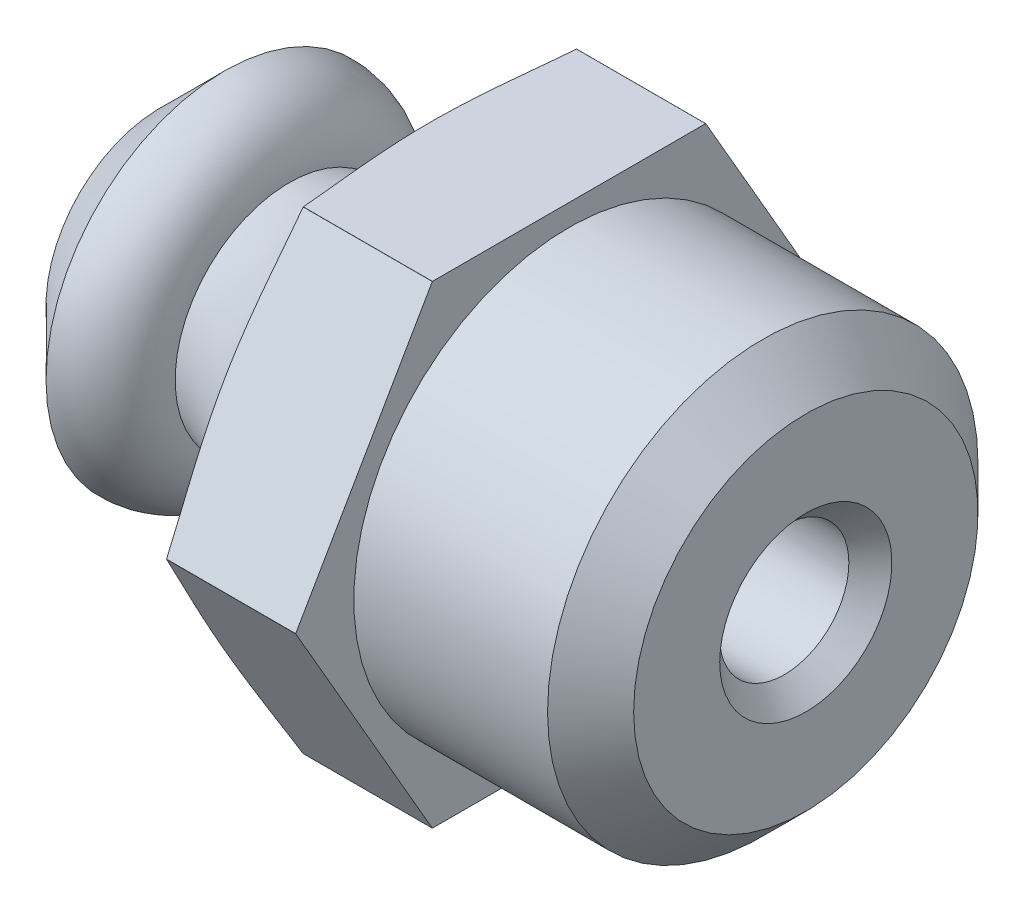
ISO-10303-21;
HEADER;
FILE_DESCRIPTION(('STEP AP214'),'2;1');
FILE_NAME('part.step','',(''),(''),'','','');
FILE_SCHEMA(('AUTOMOTIVE_DESIGN { 1 0 10303 214 1 1 1 1 }'));
ENDSEC;
DATA;
#1=APPLICATION_CONTEXT('core data for automotive mechanical design processes');
#2=APPLICATION_PROTOCOL_DEFINITION('international standard','automotive_design',2000,#1);
#3=PRODUCT_CONTEXT('',#1,'mechanical');
#4=PRODUCT('Part','Part','',(#3));
#5=PRODUCT_RELATED_PRODUCT_CATEGORY('part','',(#4));
#6=PRODUCT_DEFINITION_FORMATION('','',#4);
#7=PRODUCT_DEFINITION_CONTEXT('part definition',#1,'design');
#8=PRODUCT_DEFINITION('design','',#6,#7);
#9=PRODUCT_DEFINITION_SHAPE('','',#8);
#10=(LENGTH_UNIT() NAMED_UNIT(*) SI_UNIT(.MILLI.,.METRE.));
#11=(NAMED_UNIT(*) PLANE_ANGLE_UNIT() SI_UNIT($,.RADIAN.));
#12=(NAMED_UNIT(*) SI_UNIT($,.STERADIAN.) SOLID_ANGLE_UNIT());
#13=UNCERTAINTY_MEASURE_WITH_UNIT(LENGTH_MEASURE(1.E-05),#10,'distance_accuracy_value','');
#14=(GEOMETRIC_REPRESENTATION_CONTEXT(3) GLOBAL_UNCERTAINTY_ASSIGNED_CONTEXT((#13)) GLOBAL_UNIT_ASSIGNED_CONTEXT((#10,
#11,#12)) REPRESENTATION_CONTEXT('',''));
#15=CARTESIAN_POINT('',(0.,0.,0.));
#16=DIRECTION('',(0.,0.,1.));
#17=DIRECTION('',(1.,0.,0.));
#18=AXIS2_PLACEMENT_3D('',#15,#16,#17);
#19=CARTESIAN_POINT('',(-212.5,-8.37746538806502E-13,-3.1858908398092E-12));
#20=DIRECTION('',(-1.,0.,0.));
#21=DIRECTION('',(0.,0.,1.));
#22=AXIS2_PLACEMENT_3D('',#19,#20,#21);
#23=CONICAL_SURFACE('',#22,4.,0.785398163397446);
#24=CARTESIAN_POINT('',(-212.5,-8.37746538806502E-13,-3.1858908398092E-12));
#25=DIRECTION('',(1.,0.,0.));
#26=DIRECTION('',(0.,0.,1.));
#27=AXIS2_PLACEMENT_3D('',#24,#25,#26);
#28=CIRCLE('',#27,4.);
#29=CARTESIAN_POINT('',(-212.5,-8.37746538806502E-13,3.99999999999681));
#30=VERTEX_POINT('',#29);
#31=EDGE_CURVE('E595',#30,#30,#28,.T.);
#32=ORIENTED_EDGE('',*,*,#31,.F.);
#33=EDGE_LOOP('',(#32));
#34=FACE_BOUND('',#33,.T.);
#35=CARTESIAN_POINT('',(-213.5,-8.37746538806502E-13,-3.1858908398092E-12));
#36=DIRECTION('',(-1.,0.,0.));
#37=DIRECTION('',(0.,0.,1.));
#38=AXIS2_PLACEMENT_3D('',#35,#36,#37);
#39=CIRCLE('',#38,5.);
#40=CARTESIAN_POINT('',(-213.5,-8.37746538806502E-13,4.99999999999681));
#41=VERTEX_POINT('',#40);
#42=EDGE_CURVE('E587',#41,#41,#39,.T.);
#43=ORIENTED_EDGE('',*,*,#42,.F.);
#44=EDGE_LOOP('',(#43));
#45=FACE_BOUND('',#44,.T.);
#46=ADVANCED_FACE('F17',(#34,#45),#23,.T.);
#47=CARTESIAN_POINT('',(-212.5,-1.50000000000084,-3.1858908398092E-12));
#48=DIRECTION('',(-1.,0.,0.));
#49=DIRECTION('',(0.,0.,1.));
#50=AXIS2_PLACEMENT_3D('',#47,#48,#49);
#51=PLANE('',#50);
#52=ORIENTED_EDGE('',*,*,#31,.T.);
#53=EDGE_LOOP('',(#52));
#54=FACE_BOUND('',#53,.T.);
#55=CARTESIAN_POINT('',(-212.5,-8.37746538806502E-13,-3.1858908398092E-12));
#56=DIRECTION('',(-1.,0.,0.));
#57=DIRECTION('',(0.,0.,1.));
#58=AXIS2_PLACEMENT_3D('',#55,#56,#57);
#59=CIRCLE('',#58,2.);
#60=CARTESIAN_POINT('',(-212.5,-8.37746538806502E-13,1.99999999999682));
#61=VERTEX_POINT('',#60);
#62=EDGE_CURVE('E580',#61,#61,#59,.T.);
#63=ORIENTED_EDGE('',*,*,#62,.T.);
#64=EDGE_LOOP('',(#63));
#65=FACE_BOUND('',#64,.T.);
#66=ADVANCED_FACE('F606',(#54,#65),#51,.F.);
#67=CARTESIAN_POINT('',(-212.5,-8.37746538806502E-13,-3.1858908398092E-12));
#68=DIRECTION('',(1.,0.,0.));
#69=DIRECTION('',(0.,0.,-1.));
#70=AXIS2_PLACEMENT_3D('',#67,#68,#69);
#71=CYLINDRICAL_SURFACE('',#70,5.);
#72=CARTESIAN_POINT('',(-218.,-8.37746538806502E-13,-3.1858908398092E-12));
#73=DIRECTION('',(1.,0.,0.));
#74=DIRECTION('',(0.,0.,-1.));
#75=AXIS2_PLACEMENT_3D('',#72,#73,#74);
#76=CIRCLE('',#75,5.);
#77=CARTESIAN_POINT('',(-218.,-8.37746538806502E-13,-5.00000000000319));
#78=VERTEX_POINT('',#77);
#79=EDGE_CURVE('E143',#78,#78,#76,.T.);
#80=ORIENTED_EDGE('',*,*,#79,.T.);
#81=EDGE_LOOP('',(#80));
#82=FACE_BOUND('',#81,.T.);
#83=ORIENTED_EDGE('',*,*,#42,.T.);
#84=EDGE_LOOP('',(#83));
#85=FACE_BOUND('',#84,.T.);
#86=ADVANCED_FACE('F614',(#82,#85),#71,.T.);
#87=CARTESIAN_POINT('',(-213.,-8.37746538806502E-13,-3.1858908398092E-12));
#88=DIRECTION('',(1.,0.,0.));
#89=DIRECTION('',(0.,0.,-1.));
#90=AXIS2_PLACEMENT_3D('',#87,#88,#89);
#91=CONICAL_SURFACE('',#90,1.5,0.78539816339745);
#92=CARTESIAN_POINT('',(-213.,-8.37746538806502E-13,-3.1858908398092E-12));
#93=DIRECTION('',(1.,0.,0.));
#94=DIRECTION('',(0.,0.,1.));
#95=AXIS2_PLACEMENT_3D('',#92,#93,#94);
#96=CIRCLE('',#95,1.5);
#97=CARTESIAN_POINT('',(-213.,-8.37746538806502E-13,1.49999999999681));
#98=VERTEX_POINT('',#97);
#99=EDGE_CURVE('E136',#98,#98,#96,.T.);
#100=ORIENTED_EDGE('',*,*,#99,.F.);
#101=EDGE_LOOP('',(#100));
#102=FACE_BOUND('',#101,.T.);
#103=ORIENTED_EDGE('',*,*,#62,.F.);
#104=EDGE_LOOP('',(#103));
#105=FACE_BOUND('',#104,.T.);
#106=ADVANCED_FACE('F616',(#102,#105),#91,.F.);
#107=CARTESIAN_POINT('',(-218.,-5.00000000000084,-3.1858908398092E-12));
#108=DIRECTION('',(-1.,0.,0.));
#109=DIRECTION('',(0.,0.,1.));
#110=AXIS2_PLACEMENT_3D('',#107,#108,#109);
#111=PLANE('',#110);
#112=ORIENTED_EDGE('',*,*,#79,.F.);
#113=EDGE_LOOP('',(#112));
#114=FACE_BOUND('',#113,.T.);
#115=DIRECTION('',(0.,0.,-1.));
#116=VECTOR('',#115,1.);
#117=CARTESIAN_POINT('',(-218.,5.49999999999916,3.17372021450848));
#118=LINE('',#117,#116);
#119=CARTESIAN_POINT('',(-218.,5.49999999999916,3.17372021450848));
#120=VERTEX_POINT('',#119);
#121=CARTESIAN_POINT('',(-218.,5.49999999999916,-3.17372021451486));
#122=VERTEX_POINT('',#121);
#123=EDGE_CURVE('E119',#120,#122,#118,.T.);
#124=ORIENTED_EDGE('',*,*,#123,.F.);
#125=CARTESIAN_POINT('',(-218.,-8.37746538806502E-13,-3.1858908398092E-12));
#126=DIRECTION('',(1.,0.,0.));
#127=DIRECTION('',(0.,0.866141732283465,0.499798458978216));
#128=AXIS2_PLACEMENT_3D('',#125,#126,#127);
#129=CIRCLE('',#128,6.35);
#130=CARTESIAN_POINT('',(-218.,5.49852233027046,3.17627961355541));
#131=VERTEX_POINT('',#130);
#132=EDGE_CURVE('E107',#120,#131,#129,.T.);
#133=ORIENTED_EDGE('',*,*,#132,.T.);
#134=DIRECTION('',(0.,0.866025403784439,-0.499999999999999));
#135=VECTOR('',#134,1.);
#136=CARTESIAN_POINT('',(-218.,0.00147766972783803,6.34999982806706));
#137=LINE('',#136,#135);
#138=CARTESIAN_POINT('',(-218.,0.00147766972783901,6.34999982806706));
#139=VERTEX_POINT('',#138);
#140=EDGE_CURVE('E118',#139,#131,#137,.T.);
#141=ORIENTED_EDGE('',*,*,#140,.F.);
#142=CARTESIAN_POINT('',(-218.,-8.37746538806502E-13,-3.1858908398092E-12));
#143=DIRECTION('',(1.,0.,0.));
#144=DIRECTION('',(0.,0.000232703894279787,0.999999972924448));
#145=AXIS2_PLACEMENT_3D('',#142,#143,#144);
#146=CIRCLE('',#145,6.35);
#147=CARTESIAN_POINT('',(-218.,-0.00147766972952058,6.34999982806706));
#148=VERTEX_POINT('',#147);
#149=EDGE_CURVE('E153',#139,#148,#146,.T.);
#150=ORIENTED_EDGE('',*,*,#149,.T.);
#151=DIRECTION('',(0.,0.866025403784439,0.499999999999999));
#152=VECTOR('',#151,1.);
#153=CARTESIAN_POINT('',(-218.,-5.49852233027213,3.17627961355541));
#154=LINE('',#153,#152);
#155=CARTESIAN_POINT('',(-218.,-5.49852233027213,3.1762796135554));
#156=VERTEX_POINT('',#155);
#157=EDGE_CURVE('E159',#156,#148,#154,.T.);
#158=ORIENTED_EDGE('',*,*,#157,.F.);
#159=CARTESIAN_POINT('',(-218.,-8.37746538806502E-13,-3.1858908398092E-12));
#160=DIRECTION('',(1.,0.,0.));
#161=DIRECTION('',(0.,-0.865909028389181,0.500201513946234));
#162=AXIS2_PLACEMENT_3D('',#159,#160,#161);
#163=CIRCLE('',#162,6.35);
#164=CARTESIAN_POINT('',(-218.,-5.50000000000084,3.17372021450848));
#165=VERTEX_POINT('',#164);
#166=EDGE_CURVE('E164',#156,#165,#163,.T.);
#167=ORIENTED_EDGE('',*,*,#166,.T.);
#168=DIRECTION('',(0.,0.,1.));
#169=VECTOR('',#168,1.);
#170=CARTESIAN_POINT('',(-218.,-5.50000000000084,-3.17372021451486));
#171=LINE('',#170,#169);
#172=CARTESIAN_POINT('',(-218.,-5.50000000000084,-3.17372021451486));
#173=VERTEX_POINT('',#172);
#174=EDGE_CURVE('E170',#173,#165,#171,.T.);
#175=ORIENTED_EDGE('',*,*,#174,.F.);
#176=CARTESIAN_POINT('',(-218.,-8.37746538806502E-13,-3.1858908398092E-12));
#177=DIRECTION('',(1.,0.,0.));
#178=DIRECTION('',(0.,-0.866141732283464,-0.499798458978216));
#179=AXIS2_PLACEMENT_3D('',#176,#177,#178);
#180=CIRCLE('',#179,6.35);
#181=CARTESIAN_POINT('',(-218.,-5.49852233027213,-3.17627961356178));
#182=VERTEX_POINT('',#181);
#183=EDGE_CURVE('E175',#173,#182,#180,.T.);
#184=ORIENTED_EDGE('',*,*,#183,.T.);
#185=DIRECTION('',(0.,-0.866025403784439,0.499999999999999));
#186=VECTOR('',#185,1.);
#187=CARTESIAN_POINT('',(-218.,-0.00147766972953178,-6.34999982807345));
#188=LINE('',#187,#186);
#189=CARTESIAN_POINT('',(-218.,-0.00147766972952275,-6.34999982807343));
#190=VERTEX_POINT('',#189);
#191=EDGE_CURVE('E181',#190,#182,#188,.T.);
#192=ORIENTED_EDGE('',*,*,#191,.F.);
#193=CARTESIAN_POINT('',(-218.,-8.37746538806502E-13,-3.1858908398092E-12));
#194=DIRECTION('',(1.,0.,0.));
#195=DIRECTION('',(0.,-0.000232703894281686,-0.999999972924448));
#196=AXIS2_PLACEMENT_3D('',#193,#194,#195);
#197=CIRCLE('',#196,6.35);
#198=CARTESIAN_POINT('',(-218.,0.00147766972784292,-6.34999982807343));
#199=VERTEX_POINT('',#198);
#200=EDGE_CURVE('E186',#190,#199,#197,.T.);
#201=ORIENTED_EDGE('',*,*,#200,.T.);
#202=DIRECTION('',(0.,-0.866025403784439,-0.5));
#203=VECTOR('',#202,1.);
#204=CARTESIAN_POINT('',(-218.,5.49852233027045,-3.17627961356177));
#205=LINE('',#204,#203);
#206=CARTESIAN_POINT('',(-218.,5.49852233027046,-3.17627961356178));
#207=VERTEX_POINT('',#206);
#208=EDGE_CURVE('E192',#207,#199,#205,.T.);
#209=ORIENTED_EDGE('',*,*,#208,.F.);
#210=CARTESIAN_POINT('',(-218.,-8.37746538806502E-13,-3.1858908398092E-12));
#211=DIRECTION('',(1.,0.,0.));
#212=DIRECTION('',(0.,0.86590902838918,-0.500201513946235));
#213=AXIS2_PLACEMENT_3D('',#210,#211,#212);
#214=CIRCLE('',#213,6.35);
#215=EDGE_CURVE('E134',#207,#122,#214,.T.);
#216=ORIENTED_EDGE('',*,*,#215,.T.);
#217=EDGE_LOOP('',(#124,#133,#141,#150,#158,#167,#175,#184,#192,#201,#209,#216));
#218=FACE_BOUND('',#217,.T.);
#219=ADVANCED_FACE('F132',(#114,#218),#111,.F.);
#220=CARTESIAN_POINT('',(-212.5,-8.37746538806502E-13,-3.1858908398092E-12));
#221=DIRECTION('',(1.,0.,0.));
#222=DIRECTION('',(0.,0.,-1.));
#223=AXIS2_PLACEMENT_3D('',#220,#221,#222);
#224=CYLINDRICAL_SURFACE('',#223,1.5);
#225=CARTESIAN_POINT('',(-227.5,-8.37746538806502E-13,-3.1858908398092E-12));
#226=DIRECTION('',(1.,0.,0.));
#227=DIRECTION('',(0.,0.,-1.));
#228=AXIS2_PLACEMENT_3D('',#225,#226,#227);
#229=CIRCLE('',#228,1.5);
#230=CARTESIAN_POINT('',(-227.5,-8.37746538806502E-13,-1.50000000000319));
#231=VERTEX_POINT('',#230);
#232=EDGE_CURVE('E201',#231,#231,#229,.T.);
#233=ORIENTED_EDGE('',*,*,#232,.F.);
#234=EDGE_LOOP('',(#233));
#235=FACE_BOUND('',#234,.T.);
#236=ORIENTED_EDGE('',*,*,#99,.T.);
#237=EDGE_LOOP('',(#236));
#238=FACE_BOUND('',#237,.T.);
#239=ADVANCED_FACE('F225',(#235,#238),#224,.F.);
#240=CARTESIAN_POINT('',(-233.5,5.49999999999916,3.17542648053977));
#241=DIRECTION('',(0.,1.,0.));
#242=DIRECTION('',(0.,0.,1.));
#243=AXIS2_PLACEMENT_3D('',#240,#241,#242);
#244=PLANE('',#243);
#245=ORIENTED_EDGE('',*,*,#123,.T.);
#246=DIRECTION('',(-1.,0.,0.));
#247=VECTOR('',#246,1.);
#248=CARTESIAN_POINT('',(-218.,5.49999999999916,-3.17372021451486));
#249=LINE('',#248,#247);
#250=CARTESIAN_POINT('',(-221.,5.49999999999916,-3.17372021451484));
#251=VERTEX_POINT('',#250);
#252=EDGE_CURVE('E207',#122,#251,#249,.T.);
#253=ORIENTED_EDGE('',*,*,#252,.T.);
#254=CARTESIAN_POINT('',(-221.,5.49999999999916,-3.17372021451479));
#255=CARTESIAN_POINT('',(-221.04379076257,5.49999999999916,-2.64565917679824));
#256=CARTESIAN_POINT('',(-221.103145411652,5.49999999999916,-2.11986832347421));
#257=CARTESIAN_POINT('',(-221.195807553607,5.49999999999916,-1.06262603405977));
#258=CARTESIAN_POINT('',(-221.227160246853,5.49999999999916,-0.531679885026772));
#259=CARTESIAN_POINT('',(-221.227160246853,5.49999999999916,0.531679885020392));
#260=CARTESIAN_POINT('',(-221.195807553607,5.49999999999916,1.06262603405338));
#261=CARTESIAN_POINT('',(-221.103145411652,5.49999999999916,2.11986832346783));
#262=CARTESIAN_POINT('',(-221.04379076257,5.49999999999916,2.64565917679187));
#263=CARTESIAN_POINT('',(-221.,5.49999999999916,3.17372021450841));
#264=B_SPLINE_CURVE_WITH_KNOTS('',3,(#254,#255,#256,#257,#258,#259,#260,#261,#262,#263),
.UNSPECIFIED.,.F.,.F.,(4,2,2,2,4),(0.,1.58686010725582,3.17372021451163,4.76058032176745,
6.34744042902327),.UNSPECIFIED.);
#265=CARTESIAN_POINT('',(-221.,5.49999999999916,3.17372021450849));
#266=VERTEX_POINT('',#265);
#267=EDGE_CURVE('E126',#251,#266,#264,.T.);
#268=ORIENTED_EDGE('',*,*,#267,.T.);
#269=DIRECTION('',(1.,0.,0.));
#270=VECTOR('',#269,1.);
#271=CARTESIAN_POINT('',(-221.,5.49999999999916,3.17372021450848));
#272=LINE('',#271,#270);
#273=EDGE_CURVE('E111',#266,#120,#272,.T.);
#274=ORIENTED_EDGE('',*,*,#273,.T.);
#275=EDGE_LOOP('',(#245,#253,#268,#274));
#276=FACE_BOUND('',#275,.T.);
#277=ADVANCED_FACE('F124',(#276),#244,.T.);
#278=CARTESIAN_POINT('',(-212.5,-8.37746538806502E-13,-3.1858908398092E-12));
#279=DIRECTION('',(1.,0.,0.));
#280=DIRECTION('',(0.,0.,-1.));
#281=AXIS2_PLACEMENT_3D('',#278,#279,#280);
#282=CYLINDRICAL_SURFACE('',#281,6.35);
#283=ORIENTED_EDGE('',*,*,#273,.F.);
#284=CARTESIAN_POINT('',(-221.,-8.37746538806502E-13,-3.1858908398092E-12));
#285=DIRECTION('',(1.,0.,0.));
#286=DIRECTION('',(0.,0.866141732283464,0.499798458978216));
#287=AXIS2_PLACEMENT_3D('',#284,#285,#286);
#288=CIRCLE('',#287,6.35);
#289=CARTESIAN_POINT('',(-221.,5.49852233027044,3.17627961355541));
#290=VERTEX_POINT('',#289);
#291=EDGE_CURVE('E129',#266,#290,#288,.T.);
#292=ORIENTED_EDGE('',*,*,#291,.T.);
#293=DIRECTION('',(-1.,0.,0.));
#294=VECTOR('',#293,1.);
#295=CARTESIAN_POINT('',(-218.,5.49852233027046,3.17627961355541));
#296=LINE('',#295,#294);
#297=EDGE_CURVE('E113',#131,#290,#296,.T.);
#298=ORIENTED_EDGE('',*,*,#297,.F.);
#299=ORIENTED_EDGE('',*,*,#132,.F.);
#300=EDGE_LOOP('',(#283,#292,#298,#299));
#301=FACE_BOUND('',#300,.T.);
#302=ADVANCED_FACE('F109',(#301),#282,.T.);
#303=CARTESIAN_POINT('',(-233.5,-8.39481262282479E-13,6.35085296108269));
#304=DIRECTION('',(0.,0.499999999999999,0.866025403784439));
#305=DIRECTION('',(0.,-0.866025403784439,0.499999999999999));
#306=AXIS2_PLACEMENT_3D('',#303,#304,#305);
#307=PLANE('',#306);
#308=ORIENTED_EDGE('',*,*,#140,.T.);
#309=ORIENTED_EDGE('',*,*,#297,.T.);
#310=CARTESIAN_POINT('',(-221.,5.49852233027039,3.17627961355543));
#311=CARTESIAN_POINT('',(-221.04379076257,5.04120805685909,3.4403101324137));
#312=CARTESIAN_POINT('',(-221.103145411652,4.58585982080298,3.70320555907572));
#313=CARTESIAN_POINT('',(-221.195807553607,3.67026114021485,4.23182670378294));
#314=CARTESIAN_POINT('',(-221.227160246853,3.21044828711076,4.49729977829944));
#315=CARTESIAN_POINT('',(-221.227160246853,2.28955171288753,5.02897966332302));
#316=CARTESIAN_POINT('',(-221.195807553607,1.82973885978344,5.29445273783952));
#317=CARTESIAN_POINT('',(-221.103145411652,0.914140179195304,5.82307388254674));
#318=CARTESIAN_POINT('',(-221.04379076257,0.458791943139198,6.08596930920876));
#319=CARTESIAN_POINT('',(-221.,0.00147766972789928,6.34999982806703));
#320=B_SPLINE_CURVE_WITH_KNOTS('',3,(#310,#311,#312,#313,#314,#315,#316,#317,#318,#319),
.UNSPECIFIED.,.F.,.F.,(4,2,2,2,4),(0.,1.58686010725582,3.17372021451164,4.76058032176746,
6.34744042902327),.UNSPECIFIED.);
#321=CARTESIAN_POINT('',(-221.,0.00147766972784133,6.34999982806706));
#322=VERTEX_POINT('',#321);
#323=EDGE_CURVE('E256',#290,#322,#320,.T.);
#324=ORIENTED_EDGE('',*,*,#323,.T.);
#325=DIRECTION('',(1.,0.,0.));
#326=VECTOR('',#325,1.);
#327=CARTESIAN_POINT('',(-221.,0.00147766972783901,6.34999982806706));
#328=LINE('',#327,#326);
#329=EDGE_CURVE('E246',#322,#139,#328,.T.);
#330=ORIENTED_EDGE('',*,*,#329,.T.);
#331=EDGE_LOOP('',(#308,#309,#324,#330));
#332=FACE_BOUND('',#331,.T.);
#333=ADVANCED_FACE('F229',(#332),#307,.T.);
#334=DIRECTION('',(-1.,0.,0.));
#335=VECTOR('',#334,1.);
#336=CARTESIAN_POINT('',(-218.,-0.00147766972952058,6.34999982806706));
#337=LINE('',#336,#335);
#338=CARTESIAN_POINT('',(-221.,-0.00147766972953127,6.34999982806705));
#339=VERTEX_POINT('',#338);
#340=EDGE_CURVE('E255',#148,#339,#337,.T.);
#341=ORIENTED_EDGE('',*,*,#340,.F.);
#342=ORIENTED_EDGE('',*,*,#149,.F.);
#343=ORIENTED_EDGE('',*,*,#329,.F.);
#344=CARTESIAN_POINT('',(-221.,-8.37746538806502E-13,-3.1858908398092E-12));
#345=DIRECTION('',(1.,0.,0.));
#346=DIRECTION('',(0.,0.000232703894280231,0.999999972924448));
#347=AXIS2_PLACEMENT_3D('',#344,#345,#346);
#348=CIRCLE('',#347,6.35);
#349=EDGE_CURVE('E262',#322,#339,#348,.T.);
#350=ORIENTED_EDGE('',*,*,#349,.T.);
#351=EDGE_LOOP('',(#341,#342,#343,#350));
#352=FACE_BOUND('',#351,.T.);
#353=ADVANCED_FACE('F231',(#352),#282,.T.);
#354=CARTESIAN_POINT('',(-233.5,-5.50000000000084,3.17542648053976));
#355=DIRECTION('',(0.,-0.499999999999999,0.866025403784439));
#356=DIRECTION('',(0.,-0.866025403784439,-0.499999999999999));
#357=AXIS2_PLACEMENT_3D('',#354,#355,#356);
#358=PLANE('',#357);
#359=ORIENTED_EDGE('',*,*,#157,.T.);
#360=ORIENTED_EDGE('',*,*,#340,.T.);
#361=CARTESIAN_POINT('',(-221.,-0.00147766972957708,6.34999982806704));
#362=CARTESIAN_POINT('',(-221.04379076257,-0.458791943140879,6.08596930920876));
#363=CARTESIAN_POINT('',(-221.103145411652,-0.91414017919699,5.82307388254675));
#364=CARTESIAN_POINT('',(-221.195807553607,-1.82973885978512,5.29445273783952));
#365=CARTESIAN_POINT('',(-221.227160246853,-2.28955171288921,5.02897966332303));
#366=CARTESIAN_POINT('',(-221.227160246853,-3.21044828711244,4.49729977829945));
#367=CARTESIAN_POINT('',(-221.195807553607,-3.67026114021653,4.23182670378295));
#368=CARTESIAN_POINT('',(-221.103145411652,-4.58585982080466,3.70320555907573));
#369=CARTESIAN_POINT('',(-221.04379076257,-5.04120805686077,3.44031013241371));
#370=CARTESIAN_POINT('',(-221.,-5.49852233027207,3.17627961355544));
#371=B_SPLINE_CURVE_WITH_KNOTS('',3,(#361,#362,#363,#364,#365,#366,#367,#368,#369,#370),
.UNSPECIFIED.,.F.,.F.,(4,2,2,2,4),(0.,1.58686010725582,3.17372021451163,4.76058032176745,
6.34744042902326),.UNSPECIFIED.);
#372=CARTESIAN_POINT('',(-221.,-5.49852233027213,3.1762796135554));
#373=VERTEX_POINT('',#372);
#374=EDGE_CURVE('E268',#339,#373,#371,.T.);
#375=ORIENTED_EDGE('',*,*,#374,.T.);
#376=DIRECTION('',(1.,0.,0.));
#377=VECTOR('',#376,1.);
#378=CARTESIAN_POINT('',(-221.,-5.49852233027213,3.1762796135554));
#379=LINE('',#378,#377);
#380=EDGE_CURVE('E279',#373,#156,#379,.T.);
#381=ORIENTED_EDGE('',*,*,#380,.T.);
#382=EDGE_LOOP('',(#359,#360,#375,#381));
#383=FACE_BOUND('',#382,.T.);
#384=ADVANCED_FACE('F236',(#383),#358,.T.);
#385=DIRECTION('',(-1.,0.,0.));
#386=VECTOR('',#385,1.);
#387=CARTESIAN_POINT('',(-218.,-5.50000000000084,3.17372021450848));
#388=LINE('',#387,#386);
#389=CARTESIAN_POINT('',(-221.,-5.50000000000084,3.17372021450847));
#390=VERTEX_POINT('',#389);
#391=EDGE_CURVE('E287',#165,#390,#388,.T.);
#392=ORIENTED_EDGE('',*,*,#391,.F.);
#393=ORIENTED_EDGE('',*,*,#166,.F.);
#394=ORIENTED_EDGE('',*,*,#380,.F.);
#395=CARTESIAN_POINT('',(-221.,-8.37746538806502E-13,-3.1858908398092E-12));
#396=DIRECTION('',(1.,0.,0.));
#397=DIRECTION('',(0.,-0.865909028389181,0.500201513946234));
#398=AXIS2_PLACEMENT_3D('',#395,#396,#397);
#399=CIRCLE('',#398,6.35);
#400=EDGE_CURVE('E293',#373,#390,#399,.T.);
#401=ORIENTED_EDGE('',*,*,#400,.T.);
#402=EDGE_LOOP('',(#392,#393,#394,#401));
#403=FACE_BOUND('',#402,.T.);
#404=ADVANCED_FACE('F322',(#403),#282,.T.);
#405=CARTESIAN_POINT('',(-233.5,-5.50000000000084,-3.17542648054614));
#406=DIRECTION('',(0.,-1.,0.));
#407=DIRECTION('',(0.,0.,-1.));
#408=AXIS2_PLACEMENT_3D('',#405,#406,#407);
#409=PLANE('',#408);
#410=ORIENTED_EDGE('',*,*,#174,.T.);
#411=ORIENTED_EDGE('',*,*,#391,.T.);
#412=CARTESIAN_POINT('',(-221.,-5.50000000000084,3.17372021450841));
#413=CARTESIAN_POINT('',(-221.04379076257,-5.50000000000084,2.64565917679186));
#414=CARTESIAN_POINT('',(-221.103145411652,-5.50000000000084,2.11986832346783));
#415=CARTESIAN_POINT('',(-221.195807553607,-5.50000000000084,1.06262603405338));
#416=CARTESIAN_POINT('',(-221.227160246853,-5.50000000000084,0.531679885020394));
#417=CARTESIAN_POINT('',(-221.227160246853,-5.50000000000084,-0.531679885026773));
#418=CARTESIAN_POINT('',(-221.195807553607,-5.50000000000084,-1.06262603405977));
#419=CARTESIAN_POINT('',(-221.103145411652,-5.50000000000084,-2.11986832347422));
#420=CARTESIAN_POINT('',(-221.04379076257,-5.50000000000084,-2.64565917679825));
#421=CARTESIAN_POINT('',(-221.,-5.50000000000084,-3.17372021451479));
#422=B_SPLINE_CURVE_WITH_KNOTS('',3,(#412,#413,#414,#415,#416,#417,#418,#419,#420,#421),
.UNSPECIFIED.,.F.,.F.,(4,2,2,2,4),(0.,1.58686010725582,3.17372021451163,4.76058032176745,
6.34744042902327),.UNSPECIFIED.);
#423=CARTESIAN_POINT('',(-221.,-5.50000000000084,-3.17372021451486));
#424=VERTEX_POINT('',#423);
#425=EDGE_CURVE('E299',#390,#424,#422,.T.);
#426=ORIENTED_EDGE('',*,*,#425,.T.);
#427=DIRECTION('',(1.,0.,0.));
#428=VECTOR('',#427,1.);
#429=CARTESIAN_POINT('',(-221.,-5.50000000000084,-3.17372021451486));
#430=LINE('',#429,#428);
#431=EDGE_CURVE('E310',#424,#173,#430,.T.);
#432=ORIENTED_EDGE('',*,*,#431,.T.);
#433=EDGE_LOOP('',(#410,#411,#426,#432));
#434=FACE_BOUND('',#433,.T.);
#435=ADVANCED_FACE('F312',(#434),#409,.T.);
#436=DIRECTION('',(-1.,0.,0.));
#437=VECTOR('',#436,1.);
#438=CARTESIAN_POINT('',(-218.,-5.49852233027213,-3.17627961356178));
#439=LINE('',#438,#437);
#440=CARTESIAN_POINT('',(-221.,-5.49852233027212,-3.17627961356179));
#441=VERTEX_POINT('',#440);
#442=EDGE_CURVE('E436',#182,#441,#439,.T.);
#443=ORIENTED_EDGE('',*,*,#442,.F.);
#444=ORIENTED_EDGE('',*,*,#183,.F.);
#445=ORIENTED_EDGE('',*,*,#431,.F.);
#446=CARTESIAN_POINT('',(-221.,-8.37746538806502E-13,-3.1858908398092E-12));
#447=DIRECTION('',(1.,0.,0.));
#448=DIRECTION('',(0.,-0.866141732283465,-0.499798458978215));
#449=AXIS2_PLACEMENT_3D('',#446,#447,#448);
#450=CIRCLE('',#449,6.35);
#451=EDGE_CURVE('E430',#424,#441,#450,.T.);
#452=ORIENTED_EDGE('',*,*,#451,.T.);
#453=EDGE_LOOP('',(#443,#444,#445,#452));
#454=FACE_BOUND('',#453,.T.);
#455=ADVANCED_FACE('F321',(#454),#282,.T.);
#456=CARTESIAN_POINT('',(-233.5,-8.38180219675496E-13,-6.35085296108906));
#457=DIRECTION('',(0.,-0.499999999999999,-0.866025403784439));
#458=DIRECTION('',(0.,0.866025403784439,-0.499999999999999));
#459=AXIS2_PLACEMENT_3D('',#456,#457,#458);
#460=PLANE('',#459);
#461=ORIENTED_EDGE('',*,*,#191,.T.);
#462=ORIENTED_EDGE('',*,*,#442,.T.);
#463=CARTESIAN_POINT('',(-221.,-5.49852233027206,-3.1762796135618));
#464=CARTESIAN_POINT('',(-221.04379076257,-5.04120805686077,-3.44031013242007));
#465=CARTESIAN_POINT('',(-221.103145411652,-4.58585982080466,-3.70320555908209));
#466=CARTESIAN_POINT('',(-221.195807553607,-3.67026114021653,-4.23182670378931));
#467=CARTESIAN_POINT('',(-221.227160246853,-3.21044828711244,-4.49729977830581));
#468=CARTESIAN_POINT('',(-221.227160246853,-2.28955171288921,-5.02897966332939));
#469=CARTESIAN_POINT('',(-221.195807553607,-1.82973885978511,-5.29445273784589));
#470=CARTESIAN_POINT('',(-221.103145411652,-0.914140179196986,-5.82307388255311));
#471=CARTESIAN_POINT('',(-221.04379076257,-0.458791943140883,-6.08596930921512));
#472=CARTESIAN_POINT('',(-221.,-0.00147766972958532,-6.34999982807339));
#473=B_SPLINE_CURVE_WITH_KNOTS('',3,(#463,#464,#465,#466,#467,#468,#469,#470,#471,#472),
.UNSPECIFIED.,.F.,.F.,(4,2,2,2,4),(0.,1.58686010725581,3.17372021451163,4.76058032176744,
6.34744042902326),.UNSPECIFIED.);
#474=CARTESIAN_POINT('',(-221.,-0.00147766972952021,-6.34999982807343));
#475=VERTEX_POINT('',#474);
#476=EDGE_CURVE('E349',#441,#475,#473,.T.);
#477=ORIENTED_EDGE('',*,*,#476,.T.);
#478=DIRECTION('',(1.,0.,0.));
#479=VECTOR('',#478,1.);
#480=CARTESIAN_POINT('',(-221.,-0.00147766972952275,-6.34999982807343));
#481=LINE('',#480,#479);
#482=EDGE_CURVE('E339',#475,#190,#481,.T.);
#483=ORIENTED_EDGE('',*,*,#482,.T.);
#484=EDGE_LOOP('',(#461,#462,#477,#483));
#485=FACE_BOUND('',#484,.T.);
#486=ADVANCED_FACE('F323',(#485),#460,.T.);
#487=CARTESIAN_POINT('',(-221.,-8.37746538806502E-13,-3.1858908398092E-12));
#488=DIRECTION('',(1.,0.,0.));
#489=DIRECTION('',(0.,-0.000232703894280798,-0.999999972924448));
#490=AXIS2_PLACEMENT_3D('',#487,#488,#489);
#491=CIRCLE('',#490,6.35);
#492=CARTESIAN_POINT('',(-221.,0.0014776697278589,-6.34999982807342));
#493=VERTEX_POINT('',#492);
#494=EDGE_CURVE('E348',#475,#493,#491,.T.);
#495=ORIENTED_EDGE('',*,*,#494,.T.);
#496=DIRECTION('',(-1.,0.,0.));
#497=VECTOR('',#496,1.);
#498=CARTESIAN_POINT('',(-218.,0.00147766972784292,-6.34999982807343));
#499=LINE('',#498,#497);
#500=EDGE_CURVE('E354',#199,#493,#499,.T.);
#501=ORIENTED_EDGE('',*,*,#500,.F.);
#502=ORIENTED_EDGE('',*,*,#200,.F.);
#503=ORIENTED_EDGE('',*,*,#482,.F.);
#504=EDGE_LOOP('',(#495,#501,#502,#503));
#505=FACE_BOUND('',#504,.T.);
#506=ADVANCED_FACE('F327',(#505),#282,.T.);
#507=CARTESIAN_POINT('',(-233.5,5.49999999999916,-3.17542648054614));
#508=DIRECTION('',(0.,0.499999999999999,-0.866025403784439));
#509=DIRECTION('',(0.,0.866025403784439,0.499999999999999));
#510=AXIS2_PLACEMENT_3D('',#507,#508,#509);
#511=PLANE('',#510);
#512=ORIENTED_EDGE('',*,*,#208,.T.);
#513=ORIENTED_EDGE('',*,*,#500,.T.);
#514=CARTESIAN_POINT('',(-221.,0.00147766972790914,-6.34999982807341));
#515=CARTESIAN_POINT('',(-221.04379076257,0.458791943139212,-6.08596930921514));
#516=CARTESIAN_POINT('',(-221.103145411652,0.914140179195326,-5.82307388255312));
#517=CARTESIAN_POINT('',(-221.195807553607,1.82973885978346,-5.2944527378459));
#518=CARTESIAN_POINT('',(-221.227160246853,2.28955171288754,-5.0289796633294));
#519=CARTESIAN_POINT('',(-221.227160246853,3.21044828711077,-4.49729977830582));
#520=CARTESIAN_POINT('',(-221.195807553607,3.67026114021485,-4.23182670378933));
#521=CARTESIAN_POINT('',(-221.103145411652,4.58585982080298,-3.7032055590821));
#522=CARTESIAN_POINT('',(-221.04379076257,5.0412080568591,-3.44031013242009));
#523=CARTESIAN_POINT('',(-221.,5.4985223302704,-3.17627961356181));
#524=B_SPLINE_CURVE_WITH_KNOTS('',3,(#514,#515,#516,#517,#518,#519,#520,#521,#522,#523),
.UNSPECIFIED.,.F.,.F.,(4,2,2,2,4),(0.,1.58686010725582,3.17372021451164,4.76058032176745,
6.34744042902327),.UNSPECIFIED.);
#525=CARTESIAN_POINT('',(-221.,5.49852233027046,-3.17627961356178));
#526=VERTEX_POINT('',#525);
#527=EDGE_CURVE('E37',#493,#526,#524,.T.);
#528=ORIENTED_EDGE('',*,*,#527,.T.);
#529=DIRECTION('',(1.,0.,0.));
#530=VECTOR('',#529,1.);
#531=CARTESIAN_POINT('',(-221.,5.49852233027046,-3.17627961356178));
#532=LINE('',#531,#530);
#533=EDGE_CURVE('E369',#526,#207,#532,.T.);
#534=ORIENTED_EDGE('',*,*,#533,.T.);
#535=EDGE_LOOP('',(#512,#513,#528,#534));
#536=FACE_BOUND('',#535,.T.);
#537=ADVANCED_FACE('F329',(#536),#511,.T.);
#538=ORIENTED_EDGE('',*,*,#252,.F.);
#539=ORIENTED_EDGE('',*,*,#215,.F.);
#540=ORIENTED_EDGE('',*,*,#533,.F.);
#541=CARTESIAN_POINT('',(-221.,-8.37746538806502E-13,-3.1858908398092E-12));
#542=DIRECTION('',(1.,0.,0.));
#543=DIRECTION('',(0.,0.86590902838918,-0.500201513946235));
#544=AXIS2_PLACEMENT_3D('',#541,#542,#543);
#545=CIRCLE('',#544,6.35);
#546=EDGE_CURVE('E33',#526,#251,#545,.T.);
#547=ORIENTED_EDGE('',*,*,#546,.T.);
#548=EDGE_LOOP('',(#538,#539,#540,#547));
#549=FACE_BOUND('',#548,.T.);
#550=ADVANCED_FACE('F230',(#549),#282,.T.);
#551=CARTESIAN_POINT('',(-227.5,-2.65000000000084,-3.1858908398092E-12));
#552=DIRECTION('',(1.,0.,0.));
#553=DIRECTION('',(0.,0.,-1.));
#554=AXIS2_PLACEMENT_3D('',#551,#552,#553);
#555=PLANE('',#554);
#556=CARTESIAN_POINT('',(-227.5,-8.37746538806502E-13,-3.1858908398092E-12));
#557=DIRECTION('',(1.,0.,0.));
#558=DIRECTION('',(0.,0.,-1.));
#559=AXIS2_PLACEMENT_3D('',#556,#557,#558);
#560=CIRCLE('',#559,2.65);
#561=CARTESIAN_POINT('',(-227.5,-8.37746538806502E-13,-2.65000000000319));
#562=VERTEX_POINT('',#561);
#563=EDGE_CURVE('E381',#562,#562,#560,.T.);
#564=ORIENTED_EDGE('',*,*,#563,.F.);
#565=EDGE_LOOP('',(#564));
#566=FACE_BOUND('',#565,.T.);
#567=ORIENTED_EDGE('',*,*,#232,.T.);
#568=EDGE_LOOP('',(#567));
#569=FACE_BOUND('',#568,.T.);
#570=ADVANCED_FACE('F402',(#566,#569),#555,.F.);
#571=CARTESIAN_POINT('',(-225.493970421177,-8.37746538806502E-13,-3.1858908398092E-12));
#572=DIRECTION('',(1.,0.,0.));
#573=DIRECTION('',(0.,0.,-1.));
#574=AXIS2_PLACEMENT_3D('',#571,#572,#573);
#575=TOROIDAL_SURFACE('',#574,7.09564769570836,4.55541003999998);
#576=ORIENTED_EDGE('',*,*,#349,.F.);
#577=ORIENTED_EDGE('',*,*,#323,.F.);
#578=ORIENTED_EDGE('',*,*,#291,.F.);
#579=ORIENTED_EDGE('',*,*,#267,.F.);
#580=ORIENTED_EDGE('',*,*,#546,.F.);
#581=ORIENTED_EDGE('',*,*,#527,.F.);
#582=ORIENTED_EDGE('',*,*,#494,.F.);
#583=ORIENTED_EDGE('',*,*,#476,.F.);
#584=ORIENTED_EDGE('',*,*,#451,.F.);
#585=ORIENTED_EDGE('',*,*,#425,.F.);
#586=ORIENTED_EDGE('',*,*,#400,.F.);
#587=ORIENTED_EDGE('',*,*,#374,.F.);
#588=EDGE_LOOP('',(#576,#577,#578,#579,#580,#581,#582,#583,#584,#585,#586,#587));
#589=FACE_BOUND('',#588,.T.);
#590=CARTESIAN_POINT('',(-224.5,-8.37746538806502E-13,-3.1858908398092E-12));
#591=DIRECTION('',(1.,0.,0.));
#592=DIRECTION('',(0.,0.,-1.));
#593=AXIS2_PLACEMENT_3D('',#590,#591,#592);
#594=CIRCLE('',#593,2.65);
#595=CARTESIAN_POINT('',(-224.5,-8.37746538806502E-13,-2.65000000000319));
#596=VERTEX_POINT('',#595);
#597=EDGE_CURVE('E26',#596,#596,#594,.T.);
#598=ORIENTED_EDGE('',*,*,#597,.T.);
#599=EDGE_LOOP('',(#598));
#600=FACE_BOUND('',#599,.T.);
#601=ADVANCED_FACE('F393',(#589,#600),#575,.F.);
#602=CARTESIAN_POINT('',(-227.5,-8.37746538806502E-13,-3.1858908398092E-12));
#603=DIRECTION('',(1.,0.,0.));
#604=DIRECTION('',(0.,0.,-1.));
#605=AXIS2_PLACEMENT_3D('',#602,#603,#604);
#606=CONICAL_SURFACE('',#605,2.65,0.785398163397449);
#607=ORIENTED_EDGE('',*,*,#563,.T.);
#608=EDGE_LOOP('',(#607));
#609=FACE_BOUND('',#608,.T.);
#610=CARTESIAN_POINT('',(-226.,-8.37746538806502E-13,-3.1858908398092E-12));
#611=DIRECTION('',(1.,0.,0.));
#612=DIRECTION('',(0.,0.,-1.));
#613=AXIS2_PLACEMENT_3D('',#610,#611,#612);
#614=CIRCLE('',#613,4.15);
#615=CARTESIAN_POINT('',(-226.,-8.37746538806502E-13,-4.15000000000319));
#616=VERTEX_POINT('',#615);
#617=EDGE_CURVE('E11',#616,#616,#614,.T.);
#618=ORIENTED_EDGE('',*,*,#617,.F.);
#619=EDGE_LOOP('',(#618));
#620=FACE_BOUND('',#619,.T.);
#621=ADVANCED_FACE('F401',(#609,#620),#606,.T.);
#622=CARTESIAN_POINT('',(-226.,-8.37746538806502E-13,-3.1858908398092E-12));
#623=DIRECTION('',(1.,0.,0.));
#624=DIRECTION('',(0.,0.,-1.));
#625=AXIS2_PLACEMENT_3D('',#622,#623,#624);
#626=TOROIDAL_SURFACE('',#625,2.65,1.5);
#627=ORIENTED_EDGE('',*,*,#617,.T.);
#628=EDGE_LOOP('',(#627));
#629=FACE_BOUND('',#628,.T.);
#630=ORIENTED_EDGE('',*,*,#597,.F.);
#631=EDGE_LOOP('',(#630));
#632=FACE_BOUND('',#631,.T.);
#633=ADVANCED_FACE('F19',(#629,#632),#626,.T.);
#634=CLOSED_SHELL('',(#46,#66,#86,#106,#219,#239,#277,#302,#333,#353,#384,#404,#435,#455,#486,
#506,#537,#550,#570,#601,#621,#633));
#635=MANIFOLD_SOLID_BREP('B1',#634);
#636=ADVANCED_BREP_SHAPE_REPRESENTATION('',(#18,#635),#14);
#637=SHAPE_DEFINITION_REPRESENTATION(#9,#636);
ENDSEC;
END-ISO-10303-21;
